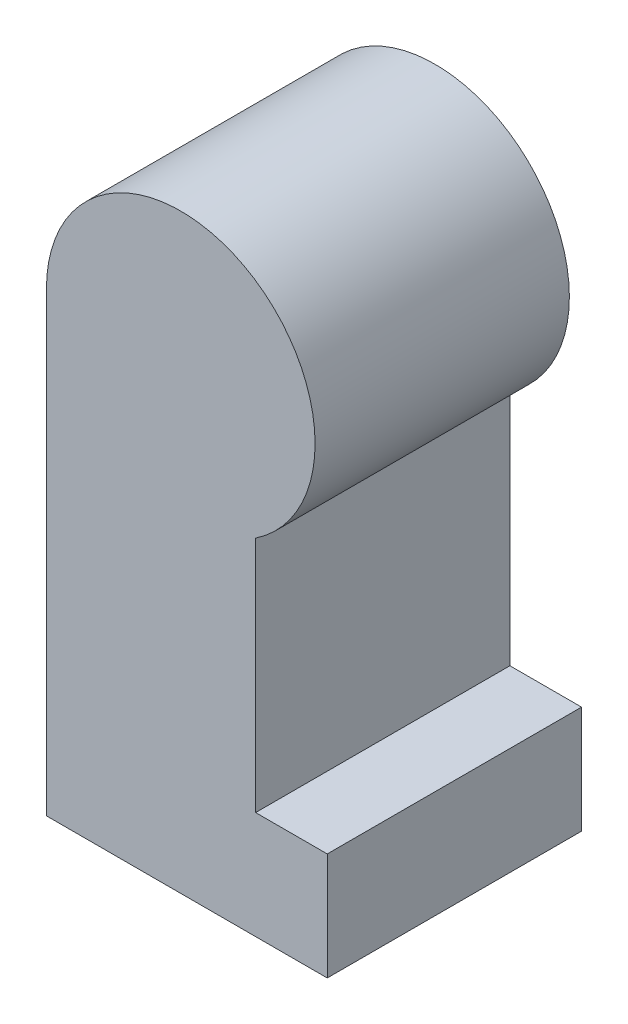
ISO-10303-21;
HEADER;
FILE_DESCRIPTION(('STEP AP214'),'2;1');
FILE_NAME('part.step','',(''),(''),'','','');
FILE_SCHEMA(('AUTOMOTIVE_DESIGN { 1 0 10303 214 1 1 1 1 }'));
ENDSEC;
DATA;
#1=APPLICATION_CONTEXT('core data for automotive mechanical design processes');
#2=APPLICATION_PROTOCOL_DEFINITION('international standard','automotive_design',2000,#1);
#3=PRODUCT_CONTEXT('',#1,'mechanical');
#4=PRODUCT('Part','Part','',(#3));
#5=PRODUCT_RELATED_PRODUCT_CATEGORY('part','',(#4));
#6=PRODUCT_DEFINITION_FORMATION('','',#4);
#7=PRODUCT_DEFINITION_CONTEXT('part definition',#1,'design');
#8=PRODUCT_DEFINITION('design','',#6,#7);
#9=PRODUCT_DEFINITION_SHAPE('','',#8);
#10=(LENGTH_UNIT() NAMED_UNIT(*) SI_UNIT(.MILLI.,.METRE.));
#11=(NAMED_UNIT(*) PLANE_ANGLE_UNIT() SI_UNIT($,.RADIAN.));
#12=(NAMED_UNIT(*) SI_UNIT($,.STERADIAN.) SOLID_ANGLE_UNIT());
#13=UNCERTAINTY_MEASURE_WITH_UNIT(LENGTH_MEASURE(1.E-05),#10,'distance_accuracy_value','');
#14=(GEOMETRIC_REPRESENTATION_CONTEXT(3) GLOBAL_UNCERTAINTY_ASSIGNED_CONTEXT((#13)) GLOBAL_UNIT_ASSIGNED_CONTEXT((#10,
#11,#12)) REPRESENTATION_CONTEXT('',''));
#15=CARTESIAN_POINT('',(0.,0.,0.));
#16=DIRECTION('',(0.,0.,1.));
#17=DIRECTION('',(1.,0.,0.));
#18=AXIS2_PLACEMENT_3D('',#15,#16,#17);
#19=CARTESIAN_POINT('',(0.,0.,180.34));
#20=DIRECTION('',(0.,0.,-1.));
#21=DIRECTION('',(-1.,0.,0.));
#22=AXIS2_PLACEMENT_3D('',#19,#20,#21);
#23=CYLINDRICAL_SURFACE('',#22,95.25);
#24=DIRECTION('',(0.,0.,-1.));
#25=VECTOR('',#24,1.);
#26=CARTESIAN_POINT('',(-95.25,0.,180.34));
#27=LINE('',#26,#25);
#28=CARTESIAN_POINT('',(-95.25,0.,29.2481119136965));
#29=VERTEX_POINT('',#28);
#30=CARTESIAN_POINT('',(-95.25,0.,0.));
#31=VERTEX_POINT('',#30);
#32=EDGE_CURVE('E145',#29,#31,#27,.T.);
#33=ORIENTED_EDGE('',*,*,#32,.F.);
#34=CARTESIAN_POINT('',(-95.25,0.,29.2481119136965));
#35=CARTESIAN_POINT('',(-95.2500220134724,0.79412124817493,29.3772159922999));
#36=CARTESIAN_POINT('',(-95.2400696552208,1.58569458789558,29.5218851932676));
#37=CARTESIAN_POINT('',(-95.2007576113502,3.16207438019551,29.841923412198));
#38=CARTESIAN_POINT('',(-95.1713991743181,3.94688126483763,30.0172904545284));
#39=CARTESIAN_POINT('',(-95.0938432863656,5.50761564638114,30.3981778823305));
#40=CARTESIAN_POINT('',(-95.0456589785493,6.28354895014491,30.6036771688688));
#41=CARTESIAN_POINT('',(-94.9311356611116,7.82557924546192,31.044376187994));
#42=CARTESIAN_POINT('',(-94.8647964323256,8.59167611815373,31.2795762791079));
#43=CARTESIAN_POINT('',(-94.7151917231344,10.1080060481254,31.7775541407689));
#44=CARTESIAN_POINT('',(-94.6320310882169,10.8583070454424,32.0401564343052));
#45=CARTESIAN_POINT('',(-94.4493982110557,12.3465005214786,32.5934245440463));
#46=CARTESIAN_POINT('',(-94.3499242554435,13.0843916878232,32.8840933067183));
#47=CARTESIAN_POINT('',(-94.0283897528177,15.2776373352656,33.7971650888949));
#48=CARTESIAN_POINT('',(-93.7831947188167,16.7127809822789,34.4607050306901));
#49=CARTESIAN_POINT('',(-93.2401126255185,19.5161096412237,35.8891148463311));
#50=CARTESIAN_POINT('',(-92.9423632278594,20.8844579463577,36.6537187088975));
#51=CARTESIAN_POINT('',(-92.302574694834,23.5515969419685,38.2794096978335));
#52=CARTESIAN_POINT('',(-91.9605367783938,24.8503895453947,39.1404941687376));
#53=CARTESIAN_POINT('',(-91.2409475157097,27.3747591589588,40.9544543379662));
#54=CARTESIAN_POINT('',(-90.8633439664957,28.6002240886648,41.9074650159224));
#55=CARTESIAN_POINT('',(-90.0827243078574,30.9713326820064,43.8985619877328));
#56=CARTESIAN_POINT('',(-89.6797067179223,32.1169716871342,44.9366532390667));
#57=CARTESIAN_POINT('',(-88.8217034992033,34.422546407602,47.1885224007182));
#58=CARTESIAN_POINT('',(-88.3652815767302,35.5747130087688,48.4097152594948));
#59=CARTESIAN_POINT('',(-87.4473067959664,37.7750229807266,50.9407046485899));
#60=CARTESIAN_POINT('',(-86.9857536791977,38.8231610845583,52.2505056594961));
#61=CARTESIAN_POINT('',(-86.0708675735019,40.8113530480422,54.9539218497321));
#62=CARTESIAN_POINT('',(-85.6175400955045,41.7513365471574,56.3475907019846));
#63=CARTESIAN_POINT('',(-84.7335727897968,43.5173466770029,59.2122337101381));
#64=CARTESIAN_POINT('',(-84.3029338193061,44.3433690039456,60.6832107827185));
#65=CARTESIAN_POINT('',(-83.4508316480257,45.9280424836334,63.799143490031));
#66=CARTESIAN_POINT('',(-83.0319808387057,46.6783003918842,65.4491289580971));
#67=CARTESIAN_POINT('',(-82.4491022802469,47.6954992146937,67.9776804866116));
#68=CARTESIAN_POINT('',(-82.2623423961026,48.0165883508517,68.8296383087411));
#69=CARTESIAN_POINT('',(-81.9061168797037,48.6217424449476,70.5501176288699));
#70=CARTESIAN_POINT('',(-81.7366489012318,48.9058124272081,71.4186368607371));
#71=CARTESIAN_POINT('',(-81.4173428093193,49.4355572452121,73.1694069319149));
#72=CARTESIAN_POINT('',(-81.2674758895146,49.6812885296786,74.0516354391522));
#73=CARTESIAN_POINT('',(-80.9890504666964,50.133888947592,75.8292190564795));
#74=CARTESIAN_POINT('',(-80.8604890767155,50.3407633467785,76.7245723701907));
#75=CARTESIAN_POINT('',(-80.6264352562528,50.7147821194324,78.526434246614));
#76=CARTESIAN_POINT('',(-80.5209403863469,50.8819306943088,79.4329416189961));
#77=CARTESIAN_POINT('',(-80.3345265663398,51.175742958584,81.2549903029368));
#78=CARTESIAN_POINT('',(-80.2536066431103,51.3024082510659,82.1705312552974));
#79=CARTESIAN_POINT('',(-80.1260654960133,51.501341849431,83.8931823198493));
#80=CARTESIAN_POINT('',(-80.0764183383897,51.5784354324405,84.69951545793));
#81=CARTESIAN_POINT('',(-79.9974301844728,51.7008607459021,86.3155748300105));
#82=CARTESIAN_POINT('',(-79.9680887008926,51.746193238544,87.1253009821169));
#83=CARTESIAN_POINT('',(-79.9300643109412,51.804908465703,88.7463353453147));
#84=CARTESIAN_POINT('',(-79.9213798856469,51.8182935493286,89.5576434356946));
#85=CARTESIAN_POINT('',(-79.9247692642722,51.8130656135579,91.1801185316249));
#86=CARTESIAN_POINT('',(-79.9368432001771,51.7944523907111,91.9912855362454));
#87=CARTESIAN_POINT('',(-79.9816027678308,51.725307265008,93.6116220468737));
#88=CARTESIAN_POINT('',(-80.0142867767079,51.6747778752837,94.4207917051201));
#89=CARTESIAN_POINT('',(-80.0998788094375,51.5420036026198,96.035534904769));
#90=CARTESIAN_POINT('',(-80.152789117391,51.4597551377222,96.8411080296267));
#91=CARTESIAN_POINT('',(-80.2782092880363,51.2638777353018,98.4467952492863));
#92=CARTESIAN_POINT('',(-80.3507166357875,51.150252824362,99.2469100310731));
#93=CARTESIAN_POINT('',(-80.5144991809705,50.8920537950337,100.840218731335));
#94=CARTESIAN_POINT('',(-80.6057761937459,50.7474766829889,101.633411972639));
#95=CARTESIAN_POINT('',(-80.8874736396491,50.2980802512926,103.852130120598));
#96=CARTESIAN_POINT('',(-81.0982228318793,49.9584592965961,105.268218032507));
#97=CARTESIAN_POINT('',(-81.5709060308241,49.1828767604152,108.064583860333));
#98=CARTESIAN_POINT('',(-81.8328357184362,48.7469233079877,109.444864786862));
#99=CARTESIAN_POINT('',(-82.3997264285212,47.782427309182,112.163903944588));
#100=CARTESIAN_POINT('',(-82.704697042851,47.2538641179652,113.502652838849));
#101=CARTESIAN_POINT('',(-83.3488899042599,46.1080995608993,116.133138881134));
#102=CARTESIAN_POINT('',(-83.6881150419726,45.4908907126572,117.424872049111));
#103=CARTESIAN_POINT('',(-84.4338042253054,44.093025956981,120.107639405374));
#104=CARTESIAN_POINT('',(-84.8434667733187,43.3016611775492,121.49221114328));
#105=CARTESIAN_POINT('',(-85.6822534320534,41.617292822323,124.191865943504));
#106=CARTESIAN_POINT('',(-86.1113786771919,40.7242833173975,125.50694494562));
#107=CARTESIAN_POINT('',(-86.9775478136139,38.839989613501,128.064042460947));
#108=CARTESIAN_POINT('',(-87.4145989547771,37.8486113021219,129.305989160864));
#109=CARTESIAN_POINT('',(-88.2846203285219,35.7722712194549,131.71063446528));
#110=CARTESIAN_POINT('',(-88.7175903651712,34.6873049801738,132.873329281454));
#111=CARTESIAN_POINT('',(-89.6215306934933,32.2860537192008,135.254838926975));
#112=CARTESIAN_POINT('',(-90.0904597812939,30.9578213844822,136.462414607273));
#113=CARTESIAN_POINT('',(-90.9933967140653,28.1935684253827,138.762801340117));
#114=CARTESIAN_POINT('',(-91.4273996821299,26.757532801822,139.855596371755));
#115=CARTESIAN_POINT('',(-92.0403123360418,24.5303057793655,141.400472075021));
#116=CARTESIAN_POINT('',(-92.2381233889816,23.7763400230092,141.89934595837));
#117=CARTESIAN_POINT('',(-92.6194413138155,22.244641846475,142.864978958007));
#118=CARTESIAN_POINT('',(-92.8029498673844,21.4669122354437,143.331741849116));
#119=CARTESIAN_POINT('',(-93.1538659917669,19.8890140093204,144.231883975318));
#120=CARTESIAN_POINT('',(-93.3212764445548,19.0888494439154,144.665269183099));
#121=CARTESIAN_POINT('',(-93.6383178594851,17.467409905948,145.497499284357));
#122=CARTESIAN_POINT('',(-93.7879500274312,16.6461363696922,145.896346519856));
#123=CARTESIAN_POINT('',(-94.1374245806488,14.5705055737626,146.847858070446));
#124=CARTESIAN_POINT('',(-94.3252358516976,13.3038653140324,147.378388800996));
#125=CARTESIAN_POINT('',(-94.6522570498188,10.7327146660136,148.355385598381));
#126=CARTESIAN_POINT('',(-94.7914802626076,9.42821473575518,148.801874629822));
#127=CARTESIAN_POINT('',(-94.9608505118198,7.44593931645848,149.406775883158));
#128=CARTESIAN_POINT('',(-95.0107868741102,6.77963752541997,149.597905020841));
#129=CARTESIAN_POINT('',(-95.0968871156354,5.44011248072531,149.957815953981));
#130=CARTESIAN_POINT('',(-95.1330511510972,4.76688930567107,150.12659800292));
#131=CARTESIAN_POINT('',(-95.1912001365327,3.41414803637315,150.441564240727));
#132=CARTESIAN_POINT('',(-95.2131765586943,2.73462640470599,150.58773479835));
#133=CARTESIAN_POINT('',(-95.242582771914,1.37070401489652,150.85710590437));
#134=CARTESIAN_POINT('',(-95.2500119398157,0.686303048999978,150.980305468561));
#135=CARTESIAN_POINT('',(-95.25,0.,151.091888086302));
#136=B_SPLINE_CURVE_WITH_KNOTS('',3,(#34,#35,#36,#37,#38,#39,#40,#41,#42,#43,#44,#45,#46,#47,
#48,#49,#50,#51,#52,#53,#54,#55,#56,#57,#58,#59,#60,#61,#62,#63,#64,#65,#66,#67,#68,#69,#70,#71,
#72,#73,#74,#75,#76,#77,#78,#79,#80,#81,#82,#83,#84,#85,#86,#87,#88,#89,#90,#91,#92,#93,#94,#95,
#96,#97,#98,#99,#100,#101,#102,#103,#104,#105,#106,#107,#108,#109,#110,#111,#112,#113,#114,#115,
#116,#117,#118,#119,#120,#121,#122,#123,#124,#125,#126,#127,#128,#129,#130,#131,#132,#133,#134,
#135),.UNSPECIFIED.,.F.,.F.,(4,2,2,2,2,2,2,2,2,2,2,2,2,2,2,2,2,2,2,2,2,2,2,2,2,2,2,2,2,2,2,2,2,
2,2,2,2,2,2,2,2,2,2,2,2,2,2,2,2,2,4),(0.,2.41340083995905,4.82664641685824,7.23821021099755,
9.64980311860939,12.0468040549886,14.4440569068997,19.2378763681504,24.0193203037042,
28.8006326704239,33.5890757515286,38.3777980445434,43.5918802267156,48.806226263165,
54.0239455656036,59.2418618633125,64.8143780075282,67.6017682142924,70.3887797153127,
73.171648172161,75.9541392325705,78.7363358852273,81.5184223530045,83.9521599534604,
86.3858391480794,88.819339387579,91.2528550997284,93.686179216691,96.119778203533,
98.5530650282433,100.986587303657,105.395770046019,109.804580859701,114.214375751989,
118.624543084757,123.55924557632,128.494236066167,133.433994389141,138.37398867241,
143.933312140623,149.493410542445,152.268976791837,155.044216198802,157.818957837879,
160.593511173871,164.747724091098,168.900800206016,170.985266143249,173.069708434574,
175.15540246729,177.241185842292),.UNSPECIFIED.);
#137=CARTESIAN_POINT('',(-95.25,0.,151.091888086302));
#138=VERTEX_POINT('',#137);
#139=EDGE_CURVE('E47',#29,#138,#136,.T.);
#140=ORIENTED_EDGE('',*,*,#139,.T.);
#141=CARTESIAN_POINT('',(-95.25,0.,180.34));
#142=VERTEX_POINT('',#141);
#143=EDGE_CURVE('E41',#142,#138,#27,.T.);
#144=ORIENTED_EDGE('',*,*,#143,.F.);
#145=CARTESIAN_POINT('',(0.,0.,180.34));
#146=DIRECTION('',(0.,0.,1.));
#147=DIRECTION('',(1.,0.,0.));
#148=AXIS2_PLACEMENT_3D('',#145,#146,#147);
#149=CIRCLE('',#148,95.25);
#150=CARTESIAN_POINT('',(53.086,-79.0850118796223,180.34));
#151=VERTEX_POINT('',#150);
#152=EDGE_CURVE('E139',#151,#142,#149,.T.);
#153=ORIENTED_EDGE('',*,*,#152,.F.);
#154=DIRECTION('',(0.,0.,-1.));
#155=VECTOR('',#154,1.);
#156=CARTESIAN_POINT('',(53.086,-79.0850118796223,180.34));
#157=LINE('',#156,#155);
#158=CARTESIAN_POINT('',(53.086,-79.0850118796223,0.));
#159=VERTEX_POINT('',#158);
#160=EDGE_CURVE('E123',#151,#159,#157,.T.);
#161=ORIENTED_EDGE('',*,*,#160,.T.);
#162=CARTESIAN_POINT('',(0.,0.,0.));
#163=DIRECTION('',(0.,0.,1.));
#164=DIRECTION('',(1.,0.,0.));
#165=AXIS2_PLACEMENT_3D('',#162,#163,#164);
#166=CIRCLE('',#165,95.25);
#167=EDGE_CURVE('E127',#159,#31,#166,.T.);
#168=ORIENTED_EDGE('',*,*,#167,.T.);
#169=EDGE_LOOP('',(#33,#140,#144,#153,#161,#168));
#170=FACE_BOUND('',#169,.T.);
#171=ADVANCED_FACE('F33',(#170),#23,.T.);
#172=CARTESIAN_POINT('',(-95.25,0.,180.34));
#173=DIRECTION('',(1.,0.,0.));
#174=DIRECTION('',(0.,1.,0.));
#175=AXIS2_PLACEMENT_3D('',#172,#173,#174);
#176=PLANE('',#175);
#177=CARTESIAN_POINT('',(-95.25,-209.55,90.17));
#178=DIRECTION('',(-1.,0.,0.));
#179=DIRECTION('',(0.,-1.,0.));
#180=AXIS2_PLACEMENT_3D('',#177,#178,#179);
#181=CIRCLE('',#180,61.722);
#182=CARTESIAN_POINT('',(-95.25,-271.272,90.17));
#183=VERTEX_POINT('',#182);
#184=EDGE_CURVE('E333',#183,#183,#181,.T.);
#185=ORIENTED_EDGE('',*,*,#184,.F.);
#186=EDGE_LOOP('',(#185));
#187=FACE_BOUND('',#186,.T.);
#188=ORIENTED_EDGE('',*,*,#143,.T.);
#189=CARTESIAN_POINT('',(-95.25,-9.90599999999995,90.1699999999993));
#190=DIRECTION('',(1.,0.,0.));
#191=DIRECTION('',(0.,1.,0.));
#192=AXIS2_PLACEMENT_3D('',#189,#190,#191);
#193=CIRCLE('',#192,61.722);
#194=EDGE_CURVE('E11',#138,#29,#193,.T.);
#195=ORIENTED_EDGE('',*,*,#194,.T.);
#196=ORIENTED_EDGE('',*,*,#32,.T.);
#197=DIRECTION('',(0.,-1.,0.));
#198=VECTOR('',#197,1.);
#199=CARTESIAN_POINT('',(-95.25,0.,0.));
#200=LINE('',#199,#198);
#201=CARTESIAN_POINT('',(-95.25,-323.85,0.));
#202=VERTEX_POINT('',#201);
#203=EDGE_CURVE('E130',#31,#202,#200,.T.);
#204=ORIENTED_EDGE('',*,*,#203,.T.);
#205=DIRECTION('',(0.,0.,-1.));
#206=VECTOR('',#205,1.);
#207=CARTESIAN_POINT('',(-95.25,-323.85,180.34));
#208=LINE('',#207,#206);
#209=CARTESIAN_POINT('',(-95.25,-323.85,180.34));
#210=VERTEX_POINT('',#209);
#211=EDGE_CURVE('E143',#210,#202,#208,.T.);
#212=ORIENTED_EDGE('',*,*,#211,.F.);
#213=DIRECTION('',(0.,-1.,0.));
#214=VECTOR('',#213,1.);
#215=CARTESIAN_POINT('',(-95.25,0.,180.34));
#216=LINE('',#215,#214);
#217=EDGE_CURVE('E91',#142,#210,#216,.T.);
#218=ORIENTED_EDGE('',*,*,#217,.F.);
#219=EDGE_LOOP('',(#188,#195,#196,#204,#212,#218));
#220=FACE_BOUND('',#219,.T.);
#221=ADVANCED_FACE('F149',(#187,#220),#176,.F.);
#222=CARTESIAN_POINT('',(-95.25,-323.85,180.34));
#223=DIRECTION('',(0.,1.,0.));
#224=DIRECTION('',(0.,0.,1.));
#225=AXIS2_PLACEMENT_3D('',#222,#223,#224);
#226=PLANE('',#225);
#227=CARTESIAN_POINT('',(4.31800000000003,-323.85,90.17));
#228=DIRECTION('',(0.,-1.,0.));
#229=DIRECTION('',(0.,0.,-1.));
#230=AXIS2_PLACEMENT_3D('',#227,#228,#229);
#231=CIRCLE('',#230,61.722);
#232=CARTESIAN_POINT('',(4.31800000000003,-323.85,28.448));
#233=VERTEX_POINT('',#232);
#234=EDGE_CURVE('E310',#233,#233,#231,.T.);
#235=ORIENTED_EDGE('',*,*,#234,.F.);
#236=EDGE_LOOP('',(#235));
#237=FACE_BOUND('',#236,.T.);
#238=DIRECTION('',(1.,0.,0.));
#239=VECTOR('',#238,1.);
#240=CARTESIAN_POINT('',(-95.25,-323.85,0.));
#241=LINE('',#240,#239);
#242=CARTESIAN_POINT('',(103.886,-323.85,0.));
#243=VERTEX_POINT('',#242);
#244=EDGE_CURVE('E133',#202,#243,#241,.T.);
#245=ORIENTED_EDGE('',*,*,#244,.T.);
#246=DIRECTION('',(0.,0.,-1.));
#247=VECTOR('',#246,1.);
#248=CARTESIAN_POINT('',(103.886,-323.85,180.34));
#249=LINE('',#248,#247);
#250=CARTESIAN_POINT('',(103.886,-323.85,180.34));
#251=VERTEX_POINT('',#250);
#252=EDGE_CURVE('E118',#251,#243,#249,.T.);
#253=ORIENTED_EDGE('',*,*,#252,.F.);
#254=DIRECTION('',(1.,0.,0.));
#255=VECTOR('',#254,1.);
#256=CARTESIAN_POINT('',(-95.25,-323.85,180.34));
#257=LINE('',#256,#255);
#258=EDGE_CURVE('E106',#210,#251,#257,.T.);
#259=ORIENTED_EDGE('',*,*,#258,.F.);
#260=ORIENTED_EDGE('',*,*,#211,.T.);
#261=EDGE_LOOP('',(#245,#253,#259,#260));
#262=FACE_BOUND('',#261,.T.);
#263=ADVANCED_FACE('F170',(#237,#262),#226,.F.);
#264=CARTESIAN_POINT('',(103.886,-323.85,180.34));
#265=DIRECTION('',(-1.,0.,0.));
#266=DIRECTION('',(0.,0.,1.));
#267=AXIS2_PLACEMENT_3D('',#264,#265,#266);
#268=PLANE('',#267);
#269=DIRECTION('',(0.,1.,0.));
#270=VECTOR('',#269,1.);
#271=CARTESIAN_POINT('',(103.886,-323.85,0.));
#272=LINE('',#271,#270);
#273=CARTESIAN_POINT('',(103.886,-247.65,0.));
#274=VERTEX_POINT('',#273);
#275=EDGE_CURVE('E115',#243,#274,#272,.T.);
#276=ORIENTED_EDGE('',*,*,#275,.T.);
#277=DIRECTION('',(0.,0.,-1.));
#278=VECTOR('',#277,1.);
#279=CARTESIAN_POINT('',(103.886,-247.65,180.34));
#280=LINE('',#279,#278);
#281=CARTESIAN_POINT('',(103.886,-247.65,180.34));
#282=VERTEX_POINT('',#281);
#283=EDGE_CURVE('E112',#282,#274,#280,.T.);
#284=ORIENTED_EDGE('',*,*,#283,.F.);
#285=DIRECTION('',(0.,1.,0.));
#286=VECTOR('',#285,1.);
#287=CARTESIAN_POINT('',(103.886,-323.85,180.34));
#288=LINE('',#287,#286);
#289=EDGE_CURVE('E99',#251,#282,#288,.T.);
#290=ORIENTED_EDGE('',*,*,#289,.F.);
#291=ORIENTED_EDGE('',*,*,#252,.T.);
#292=EDGE_LOOP('',(#276,#284,#290,#291));
#293=FACE_BOUND('',#292,.T.);
#294=ADVANCED_FACE('F113',(#293),#268,.F.);
#295=CARTESIAN_POINT('',(103.886,-247.65,180.34));
#296=DIRECTION('',(0.,-1.,0.));
#297=DIRECTION('',(0.,0.,-1.));
#298=AXIS2_PLACEMENT_3D('',#295,#296,#297);
#299=PLANE('',#298);
#300=DIRECTION('',(-1.,0.,0.));
#301=VECTOR('',#300,1.);
#302=CARTESIAN_POINT('',(103.886,-247.65,0.));
#303=LINE('',#302,#301);
#304=CARTESIAN_POINT('',(53.086,-247.65,0.));
#305=VERTEX_POINT('',#304);
#306=EDGE_CURVE('E136',#274,#305,#303,.T.);
#307=ORIENTED_EDGE('',*,*,#306,.T.);
#308=DIRECTION('',(0.,0.,-1.));
#309=VECTOR('',#308,1.);
#310=CARTESIAN_POINT('',(53.086,-247.65,180.34));
#311=LINE('',#310,#309);
#312=CARTESIAN_POINT('',(53.086,-247.65,180.34));
#313=VERTEX_POINT('',#312);
#314=EDGE_CURVE('E119',#313,#305,#311,.T.);
#315=ORIENTED_EDGE('',*,*,#314,.F.);
#316=DIRECTION('',(-1.,0.,0.));
#317=VECTOR('',#316,1.);
#318=CARTESIAN_POINT('',(103.886,-247.65,180.34));
#319=LINE('',#318,#317);
#320=EDGE_CURVE('E103',#282,#313,#319,.T.);
#321=ORIENTED_EDGE('',*,*,#320,.F.);
#322=ORIENTED_EDGE('',*,*,#283,.T.);
#323=EDGE_LOOP('',(#307,#315,#321,#322));
#324=FACE_BOUND('',#323,.T.);
#325=ADVANCED_FACE('F121',(#324),#299,.F.);
#326=CARTESIAN_POINT('',(53.086,-247.65,180.34));
#327=DIRECTION('',(-1.,0.,0.));
#328=DIRECTION('',(0.,0.,1.));
#329=AXIS2_PLACEMENT_3D('',#326,#327,#328);
#330=PLANE('',#329);
#331=DIRECTION('',(0.,1.,0.));
#332=VECTOR('',#331,1.);
#333=CARTESIAN_POINT('',(53.086,-247.65,0.));
#334=LINE('',#333,#332);
#335=EDGE_CURVE('E82',#305,#159,#334,.T.);
#336=ORIENTED_EDGE('',*,*,#335,.T.);
#337=ORIENTED_EDGE('',*,*,#160,.F.);
#338=DIRECTION('',(0.,1.,0.));
#339=VECTOR('',#338,1.);
#340=CARTESIAN_POINT('',(53.086,-247.65,180.34));
#341=LINE('',#340,#339);
#342=EDGE_CURVE('E55',#313,#151,#341,.T.);
#343=ORIENTED_EDGE('',*,*,#342,.F.);
#344=ORIENTED_EDGE('',*,*,#314,.T.);
#345=EDGE_LOOP('',(#336,#337,#343,#344));
#346=FACE_BOUND('',#345,.T.);
#347=ADVANCED_FACE('F156',(#346),#330,.F.);
#348=CARTESIAN_POINT('',(0.,0.,180.34));
#349=DIRECTION('',(0.,0.,1.));
#350=DIRECTION('',(1.,0.,0.));
#351=AXIS2_PLACEMENT_3D('',#348,#349,#350);
#352=PLANE('',#351);
#353=ORIENTED_EDGE('',*,*,#152,.T.);
#354=ORIENTED_EDGE('',*,*,#217,.T.);
#355=ORIENTED_EDGE('',*,*,#258,.T.);
#356=ORIENTED_EDGE('',*,*,#289,.T.);
#357=ORIENTED_EDGE('',*,*,#320,.T.);
#358=ORIENTED_EDGE('',*,*,#342,.T.);
#359=EDGE_LOOP('',(#353,#354,#355,#356,#357,#358));
#360=FACE_BOUND('',#359,.T.);
#361=ADVANCED_FACE('F101',(#360),#352,.T.);
#362=CARTESIAN_POINT('',(0.,0.,0.));
#363=DIRECTION('',(0.,0.,1.));
#364=DIRECTION('',(1.,0.,0.));
#365=AXIS2_PLACEMENT_3D('',#362,#363,#364);
#366=PLANE('',#365);
#367=CARTESIAN_POINT('',(0.,0.,0.));
#368=DIRECTION('',(0.,0.,-1.));
#369=DIRECTION('',(-1.,0.,0.));
#370=AXIS2_PLACEMENT_3D('',#367,#368,#369);
#371=CIRCLE('',#370,38.1);
#372=CARTESIAN_POINT('',(-38.1,0.,0.));
#373=VERTEX_POINT('',#372);
#374=EDGE_CURVE('E317',#373,#373,#371,.T.);
#375=ORIENTED_EDGE('',*,*,#374,.F.);
#376=EDGE_LOOP('',(#375));
#377=FACE_BOUND('',#376,.T.);
#378=ORIENTED_EDGE('',*,*,#167,.F.);
#379=ORIENTED_EDGE('',*,*,#335,.F.);
#380=ORIENTED_EDGE('',*,*,#306,.F.);
#381=ORIENTED_EDGE('',*,*,#275,.F.);
#382=ORIENTED_EDGE('',*,*,#244,.F.);
#383=ORIENTED_EDGE('',*,*,#203,.F.);
#384=EDGE_LOOP('',(#378,#379,#380,#381,#382,#383));
#385=FACE_BOUND('',#384,.T.);
#386=ADVANCED_FACE('F154',(#377,#385),#366,.F.);
#387=CARTESIAN_POINT('',(0.,0.,101.6));
#388=DIRECTION('',(0.,0.,-1.));
#389=DIRECTION('',(-1.,0.,0.));
#390=AXIS2_PLACEMENT_3D('',#387,#388,#389);
#391=CYLINDRICAL_SURFACE('',#390,38.1);
#392=CARTESIAN_POINT('',(0.,0.,101.6));
#393=DIRECTION('',(0.,0.,-1.));
#394=DIRECTION('',(-1.,0.,0.));
#395=AXIS2_PLACEMENT_3D('',#392,#393,#394);
#396=CIRCLE('',#395,38.1);
#397=CARTESIAN_POINT('',(-38.1,0.,101.6));
#398=VERTEX_POINT('',#397);
#399=EDGE_CURVE('E131',#398,#398,#396,.T.);
#400=ORIENTED_EDGE('',*,*,#399,.F.);
#401=EDGE_LOOP('',(#400));
#402=FACE_BOUND('',#401,.T.);
#403=ORIENTED_EDGE('',*,*,#374,.T.);
#404=EDGE_LOOP('',(#403));
#405=FACE_BOUND('',#404,.T.);
#406=ADVANCED_FACE('F207',(#402,#405),#391,.F.);
#407=CARTESIAN_POINT('',(0.,0.,101.6));
#408=DIRECTION('',(0.,0.,-1.));
#409=DIRECTION('',(-1.,0.,0.));
#410=AXIS2_PLACEMENT_3D('',#407,#408,#409);
#411=PLANE('',#410);
#412=ORIENTED_EDGE('',*,*,#399,.T.);
#413=EDGE_LOOP('',(#412));
#414=FACE_BOUND('',#413,.T.);
#415=ADVANCED_FACE('F216',(#414),#411,.T.);
#416=CARTESIAN_POINT('',(4.31800000000003,-273.05,90.17));
#417=DIRECTION('',(0.,-1.,0.));
#418=DIRECTION('',(0.,0.,-1.));
#419=AXIS2_PLACEMENT_3D('',#416,#417,#418);
#420=CYLINDRICAL_SURFACE('',#419,61.722);
#421=CARTESIAN_POINT('',(4.31800000000003,-273.05,90.17));
#422=DIRECTION('',(0.,-1.,0.));
#423=DIRECTION('',(0.,0.,-1.));
#424=AXIS2_PLACEMENT_3D('',#421,#422,#423);
#425=CIRCLE('',#424,61.722);
#426=CARTESIAN_POINT('',(4.31800000000003,-273.05,28.448));
#427=VERTEX_POINT('',#426);
#428=EDGE_CURVE('E314',#427,#427,#425,.T.);
#429=ORIENTED_EDGE('',*,*,#428,.F.);
#430=EDGE_LOOP('',(#429));
#431=FACE_BOUND('',#430,.T.);
#432=ORIENTED_EDGE('',*,*,#234,.T.);
#433=EDGE_LOOP('',(#432));
#434=FACE_BOUND('',#433,.T.);
#435=ADVANCED_FACE('F225',(#431,#434),#420,.F.);
#436=CARTESIAN_POINT('',(4.31800000000003,-273.05,90.17));
#437=DIRECTION('',(0.,-1.,0.));
#438=DIRECTION('',(0.,0.,-1.));
#439=AXIS2_PLACEMENT_3D('',#436,#437,#438);
#440=PLANE('',#439);
#441=ORIENTED_EDGE('',*,*,#428,.T.);
#442=EDGE_LOOP('',(#441));
#443=FACE_BOUND('',#442,.T.);
#444=ADVANCED_FACE('F241',(#443),#440,.T.);
#445=CARTESIAN_POINT('',(-44.45,-9.90599999999995,90.1699999999993));
#446=DIRECTION('',(-1.,0.,0.));
#447=DIRECTION('',(0.,-1.,0.));
#448=AXIS2_PLACEMENT_3D('',#445,#446,#447);
#449=CYLINDRICAL_SURFACE('',#448,61.722);
#450=CARTESIAN_POINT('',(-44.45,-9.90599999999995,90.1699999999993));
#451=DIRECTION('',(-1.,0.,0.));
#452=DIRECTION('',(0.,-1.,0.));
#453=AXIS2_PLACEMENT_3D('',#450,#451,#452);
#454=CIRCLE('',#453,61.722);
#455=CARTESIAN_POINT('',(-44.45,-71.628,90.1699999999993));
#456=VERTEX_POINT('',#455);
#457=EDGE_CURVE('E312',#456,#456,#454,.T.);
#458=ORIENTED_EDGE('',*,*,#457,.F.);
#459=EDGE_LOOP('',(#458));
#460=FACE_BOUND('',#459,.T.);
#461=ORIENTED_EDGE('',*,*,#194,.F.);
#462=ORIENTED_EDGE('',*,*,#139,.F.);
#463=EDGE_LOOP('',(#461,#462));
#464=FACE_BOUND('',#463,.T.);
#465=ADVANCED_FACE('F250',(#460,#464),#449,.F.);
#466=CARTESIAN_POINT('',(-44.45,-9.90599999999995,90.1699999999993));
#467=DIRECTION('',(-1.,0.,0.));
#468=DIRECTION('',(0.,-1.,0.));
#469=AXIS2_PLACEMENT_3D('',#466,#467,#468);
#470=PLANE('',#469);
#471=ORIENTED_EDGE('',*,*,#457,.T.);
#472=EDGE_LOOP('',(#471));
#473=FACE_BOUND('',#472,.T.);
#474=ADVANCED_FACE('F268',(#473),#470,.T.);
#475=CARTESIAN_POINT('',(-44.45,-209.55,90.17));
#476=DIRECTION('',(-1.,0.,0.));
#477=DIRECTION('',(0.,-1.,0.));
#478=AXIS2_PLACEMENT_3D('',#475,#476,#477);
#479=CYLINDRICAL_SURFACE('',#478,61.722);
#480=CARTESIAN_POINT('',(-44.45,-209.55,90.17));
#481=DIRECTION('',(-1.,0.,0.));
#482=DIRECTION('',(0.,-1.,0.));
#483=AXIS2_PLACEMENT_3D('',#480,#481,#482);
#484=CIRCLE('',#483,61.722);
#485=CARTESIAN_POINT('',(-44.45,-271.272,90.17));
#486=VERTEX_POINT('',#485);
#487=EDGE_CURVE('E311',#486,#486,#484,.T.);
#488=ORIENTED_EDGE('',*,*,#487,.F.);
#489=EDGE_LOOP('',(#488));
#490=FACE_BOUND('',#489,.T.);
#491=ORIENTED_EDGE('',*,*,#184,.T.);
#492=EDGE_LOOP('',(#491));
#493=FACE_BOUND('',#492,.T.);
#494=ADVANCED_FACE('F278',(#490,#493),#479,.F.);
#495=CARTESIAN_POINT('',(-44.45,-209.55,90.17));
#496=DIRECTION('',(-1.,0.,0.));
#497=DIRECTION('',(0.,-1.,0.));
#498=AXIS2_PLACEMENT_3D('',#495,#496,#497);
#499=PLANE('',#498);
#500=ORIENTED_EDGE('',*,*,#487,.T.);
#501=EDGE_LOOP('',(#500));
#502=FACE_BOUND('',#501,.T.);
#503=ADVANCED_FACE('F288',(#502),#499,.T.);
#504=CLOSED_SHELL('',(#171,#221,#263,#294,#325,#347,#361,#386,#406,#415,#435,#444,#465,#474,
#494,#503));
#505=MANIFOLD_SOLID_BREP('B2',#504);
#506=ADVANCED_BREP_SHAPE_REPRESENTATION('',(#18,#505),#14);
#507=SHAPE_DEFINITION_REPRESENTATION(#9,#506);
ENDSEC;
END-ISO-10303-21;
